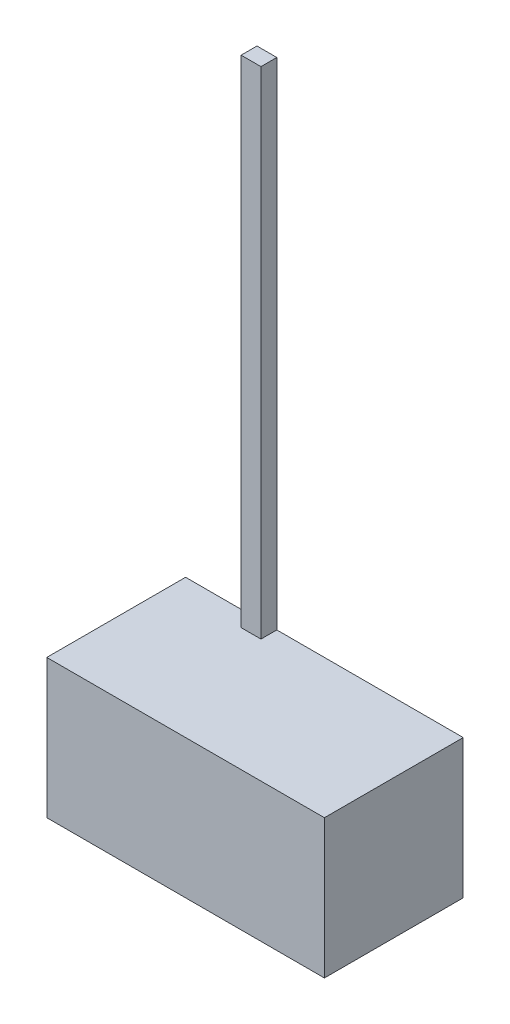
ISO-10303-21;
HEADER;
FILE_DESCRIPTION(('STEP AP214'),'2;1');
FILE_NAME('part.step','',(''),(''),'','','');
FILE_SCHEMA(('AUTOMOTIVE_DESIGN { 1 0 10303 214 1 1 1 1 }'));
ENDSEC;
DATA;
#1=APPLICATION_CONTEXT('core data for automotive mechanical design processes');
#2=APPLICATION_PROTOCOL_DEFINITION('international standard','automotive_design',2000,#1);
#3=PRODUCT_CONTEXT('',#1,'mechanical');
#4=PRODUCT('Part','Part','',(#3));
#5=PRODUCT_RELATED_PRODUCT_CATEGORY('part','',(#4));
#6=PRODUCT_DEFINITION_FORMATION('','',#4);
#7=PRODUCT_DEFINITION_CONTEXT('part definition',#1,'design');
#8=PRODUCT_DEFINITION('design','',#6,#7);
#9=PRODUCT_DEFINITION_SHAPE('','',#8);
#10=(LENGTH_UNIT() NAMED_UNIT(*) SI_UNIT(.MILLI.,.METRE.));
#11=(NAMED_UNIT(*) PLANE_ANGLE_UNIT() SI_UNIT($,.RADIAN.));
#12=(NAMED_UNIT(*) SI_UNIT($,.STERADIAN.) SOLID_ANGLE_UNIT());
#13=UNCERTAINTY_MEASURE_WITH_UNIT(LENGTH_MEASURE(1.E-05),#10,'distance_accuracy_value','');
#14=(GEOMETRIC_REPRESENTATION_CONTEXT(3) GLOBAL_UNCERTAINTY_ASSIGNED_CONTEXT((#13)) GLOBAL_UNIT_ASSIGNED_CONTEXT((#10,
#11,#12)) REPRESENTATION_CONTEXT('',''));
#15=CARTESIAN_POINT('',(0.,0.,0.));
#16=DIRECTION('',(0.,0.,1.));
#17=DIRECTION('',(1.,0.,0.));
#18=AXIS2_PLACEMENT_3D('',#15,#16,#17);
#19=CARTESIAN_POINT('',(2300.,-1450.,350.));
#20=DIRECTION('',(0.,-1.,0.));
#21=DIRECTION('',(0.,0.,-1.));
#22=AXIS2_PLACEMENT_3D('',#19,#20,#21);
#23=PLANE('',#22);
#24=DIRECTION('',(-1.,0.,0.));
#25=VECTOR('',#24,1.);
#26=CARTESIAN_POINT('',(2300.,-1450.,0.));
#27=LINE('',#26,#25);
#28=CARTESIAN_POINT('',(2300.,-1450.,0.));
#29=VERTEX_POINT('',#28);
#30=CARTESIAN_POINT('',(1600.,-1450.,0.));
#31=VERTEX_POINT('',#30);
#32=EDGE_CURVE('E115',#29,#31,#27,.T.);
#33=ORIENTED_EDGE('',*,*,#32,.T.);
#34=DIRECTION('',(0.,0.,-1.));
#35=VECTOR('',#34,1.);
#36=CARTESIAN_POINT('',(1600.,-1450.,350.));
#37=LINE('',#36,#35);
#38=CARTESIAN_POINT('',(1600.,-1450.,350.));
#39=VERTEX_POINT('',#38);
#40=EDGE_CURVE('E12',#39,#31,#37,.T.);
#41=ORIENTED_EDGE('',*,*,#40,.F.);
#42=DIRECTION('',(-1.,0.,0.));
#43=VECTOR('',#42,1.);
#44=CARTESIAN_POINT('',(2300.,-1450.,350.));
#45=LINE('',#44,#43);
#46=CARTESIAN_POINT('',(2300.,-1450.,350.));
#47=VERTEX_POINT('',#46);
#48=EDGE_CURVE('E99',#47,#39,#45,.T.);
#49=ORIENTED_EDGE('',*,*,#48,.F.);
#50=DIRECTION('',(0.,0.,-1.));
#51=VECTOR('',#50,1.);
#52=CARTESIAN_POINT('',(2300.,-1450.,350.));
#53=LINE('',#52,#51);
#54=EDGE_CURVE('E110',#47,#29,#53,.T.);
#55=ORIENTED_EDGE('',*,*,#54,.T.);
#56=EDGE_LOOP('',(#33,#41,#49,#55));
#57=FACE_BOUND('',#56,.T.);
#58=ADVANCED_FACE('F47',(#57),#23,.F.);
#59=CARTESIAN_POINT('',(1600.,-1450.,350.));
#60=DIRECTION('',(1.,0.,0.));
#61=DIRECTION('',(0.,0.,-1.));
#62=AXIS2_PLACEMENT_3D('',#59,#60,#61);
#63=PLANE('',#62);
#64=DIRECTION('',(0.,-1.,0.));
#65=VECTOR('',#64,1.);
#66=CARTESIAN_POINT('',(1600.,-1450.,0.));
#67=LINE('',#66,#65);
#68=CARTESIAN_POINT('',(1600.,-1800.,0.));
#69=VERTEX_POINT('',#68);
#70=EDGE_CURVE('E101',#31,#69,#67,.T.);
#71=ORIENTED_EDGE('',*,*,#70,.T.);
#72=DIRECTION('',(0.,0.,-1.));
#73=VECTOR('',#72,1.);
#74=CARTESIAN_POINT('',(1600.,-1800.,350.));
#75=LINE('',#74,#73);
#76=CARTESIAN_POINT('',(1600.,-1800.,350.));
#77=VERTEX_POINT('',#76);
#78=EDGE_CURVE('E60',#77,#69,#75,.T.);
#79=ORIENTED_EDGE('',*,*,#78,.F.);
#80=DIRECTION('',(0.,-1.,0.));
#81=VECTOR('',#80,1.);
#82=CARTESIAN_POINT('',(1600.,-1450.,350.));
#83=LINE('',#82,#81);
#84=EDGE_CURVE('E94',#39,#77,#83,.T.);
#85=ORIENTED_EDGE('',*,*,#84,.F.);
#86=ORIENTED_EDGE('',*,*,#40,.T.);
#87=EDGE_LOOP('',(#71,#79,#85,#86));
#88=FACE_BOUND('',#87,.T.);
#89=ADVANCED_FACE('F104',(#88),#63,.F.);
#90=CARTESIAN_POINT('',(1600.,-1800.,350.));
#91=DIRECTION('',(0.,1.,0.));
#92=DIRECTION('',(0.,0.,1.));
#93=AXIS2_PLACEMENT_3D('',#90,#91,#92);
#94=PLANE('',#93);
#95=DIRECTION('',(1.,0.,0.));
#96=VECTOR('',#95,1.);
#97=CARTESIAN_POINT('',(1600.,-1800.,0.));
#98=LINE('',#97,#96);
#99=CARTESIAN_POINT('',(2300.,-1800.,0.));
#100=VERTEX_POINT('',#99);
#101=EDGE_CURVE('E85',#69,#100,#98,.T.);
#102=ORIENTED_EDGE('',*,*,#101,.T.);
#103=DIRECTION('',(0.,0.,-1.));
#104=VECTOR('',#103,1.);
#105=CARTESIAN_POINT('',(2300.,-1800.,350.));
#106=LINE('',#105,#104);
#107=CARTESIAN_POINT('',(2300.,-1800.,350.));
#108=VERTEX_POINT('',#107);
#109=EDGE_CURVE('E103',#108,#100,#106,.T.);
#110=ORIENTED_EDGE('',*,*,#109,.F.);
#111=DIRECTION('',(1.,0.,0.));
#112=VECTOR('',#111,1.);
#113=CARTESIAN_POINT('',(1600.,-1800.,350.));
#114=LINE('',#113,#112);
#115=EDGE_CURVE('E97',#77,#108,#114,.T.);
#116=ORIENTED_EDGE('',*,*,#115,.F.);
#117=ORIENTED_EDGE('',*,*,#78,.T.);
#118=EDGE_LOOP('',(#102,#110,#116,#117));
#119=FACE_BOUND('',#118,.T.);
#120=ADVANCED_FACE('F107',(#119),#94,.F.);
#121=CARTESIAN_POINT('',(2300.,-1800.,350.));
#122=DIRECTION('',(-1.,0.,0.));
#123=DIRECTION('',(0.,0.,1.));
#124=AXIS2_PLACEMENT_3D('',#121,#122,#123);
#125=PLANE('',#124);
#126=DIRECTION('',(0.,1.,0.));
#127=VECTOR('',#126,1.);
#128=CARTESIAN_POINT('',(2300.,-1800.,0.));
#129=LINE('',#128,#127);
#130=EDGE_CURVE('E88',#100,#29,#129,.T.);
#131=ORIENTED_EDGE('',*,*,#130,.T.);
#132=ORIENTED_EDGE('',*,*,#54,.F.);
#133=DIRECTION('',(0.,1.,0.));
#134=VECTOR('',#133,1.);
#135=CARTESIAN_POINT('',(2300.,-1800.,350.));
#136=LINE('',#135,#134);
#137=EDGE_CURVE('E63',#108,#47,#136,.T.);
#138=ORIENTED_EDGE('',*,*,#137,.F.);
#139=ORIENTED_EDGE('',*,*,#109,.T.);
#140=EDGE_LOOP('',(#131,#132,#138,#139));
#141=FACE_BOUND('',#140,.T.);
#142=ADVANCED_FACE('F116',(#141),#125,.F.);
#143=CARTESIAN_POINT('',(0.,0.,350.));
#144=DIRECTION('',(0.,0.,1.));
#145=DIRECTION('',(1.,0.,0.));
#146=AXIS2_PLACEMENT_3D('',#143,#144,#145);
#147=PLANE('',#146);
#148=ORIENTED_EDGE('',*,*,#48,.T.);
#149=ORIENTED_EDGE('',*,*,#84,.T.);
#150=ORIENTED_EDGE('',*,*,#115,.T.);
#151=ORIENTED_EDGE('',*,*,#137,.T.);
#152=EDGE_LOOP('',(#148,#149,#150,#151));
#153=FACE_BOUND('',#152,.T.);
#154=ADVANCED_FACE('F96',(#153),#147,.T.);
#155=CARTESIAN_POINT('',(0.,0.,0.));
#156=DIRECTION('',(0.,0.,1.));
#157=DIRECTION('',(1.,0.,0.));
#158=AXIS2_PLACEMENT_3D('',#155,#156,#157);
#159=PLANE('',#158);
#160=ORIENTED_EDGE('',*,*,#32,.F.);
#161=ORIENTED_EDGE('',*,*,#130,.F.);
#162=ORIENTED_EDGE('',*,*,#101,.F.);
#163=ORIENTED_EDGE('',*,*,#70,.F.);
#164=EDGE_LOOP('',(#160,#161,#162,#163));
#165=FACE_BOUND('',#164,.T.);
#166=ADVANCED_FACE('F122',(#165),#159,.F.);
#167=CLOSED_SHELL('',(#58,#89,#120,#142,#154,#166));
#168=MANIFOLD_SOLID_BREP('B2',#167);
#169=CARTESIAN_POINT('',(1830.,-200.,40.));
#170=DIRECTION('',(0.,-1.,0.));
#171=DIRECTION('',(0.,0.,-1.));
#172=AXIS2_PLACEMENT_3D('',#169,#170,#171);
#173=PLANE('',#172);
#174=DIRECTION('',(-1.,0.,0.));
#175=VECTOR('',#174,1.);
#176=CARTESIAN_POINT('',(1830.,-200.,0.));
#177=LINE('',#176,#175);
#178=CARTESIAN_POINT('',(1830.,-200.,0.));
#179=VERTEX_POINT('',#178);
#180=CARTESIAN_POINT('',(1780.,-200.,0.));
#181=VERTEX_POINT('',#180);
#182=EDGE_CURVE('E237',#179,#181,#177,.T.);
#183=ORIENTED_EDGE('',*,*,#182,.T.);
#184=DIRECTION('',(0.,0.,-1.));
#185=VECTOR('',#184,1.);
#186=CARTESIAN_POINT('',(1780.,-200.,40.));
#187=LINE('',#186,#185);
#188=CARTESIAN_POINT('',(1780.,-200.,40.));
#189=VERTEX_POINT('',#188);
#190=EDGE_CURVE('E50',#189,#181,#187,.T.);
#191=ORIENTED_EDGE('',*,*,#190,.F.);
#192=DIRECTION('',(-1.,0.,0.));
#193=VECTOR('',#192,1.);
#194=CARTESIAN_POINT('',(1830.,-200.,40.));
#195=LINE('',#194,#193);
#196=CARTESIAN_POINT('',(1830.,-200.,40.));
#197=VERTEX_POINT('',#196);
#198=EDGE_CURVE('E222',#197,#189,#195,.T.);
#199=ORIENTED_EDGE('',*,*,#198,.F.);
#200=DIRECTION('',(0.,0.,-1.));
#201=VECTOR('',#200,1.);
#202=CARTESIAN_POINT('',(1830.,-200.,40.));
#203=LINE('',#202,#201);
#204=EDGE_CURVE('E235',#197,#179,#203,.T.);
#205=ORIENTED_EDGE('',*,*,#204,.T.);
#206=EDGE_LOOP('',(#183,#191,#199,#205));
#207=FACE_BOUND('',#206,.T.);
#208=ADVANCED_FACE('F171',(#207),#173,.F.);
#209=CARTESIAN_POINT('',(1780.,-200.,40.));
#210=DIRECTION('',(1.,0.,0.));
#211=DIRECTION('',(0.,0.,-1.));
#212=AXIS2_PLACEMENT_3D('',#209,#210,#211);
#213=PLANE('',#212);
#214=DIRECTION('',(0.,-1.,0.));
#215=VECTOR('',#214,1.);
#216=CARTESIAN_POINT('',(1780.,-200.,0.));
#217=LINE('',#216,#215);
#218=CARTESIAN_POINT('',(1780.,-1450.,0.));
#219=VERTEX_POINT('',#218);
#220=EDGE_CURVE('E228',#181,#219,#217,.T.);
#221=ORIENTED_EDGE('',*,*,#220,.T.);
#222=DIRECTION('',(0.,0.,-1.));
#223=VECTOR('',#222,1.);
#224=CARTESIAN_POINT('',(1780.,-1450.,40.));
#225=LINE('',#224,#223);
#226=CARTESIAN_POINT('',(1780.,-1450.,40.));
#227=VERTEX_POINT('',#226);
#228=EDGE_CURVE('E181',#227,#219,#225,.T.);
#229=ORIENTED_EDGE('',*,*,#228,.F.);
#230=DIRECTION('',(0.,-1.,0.));
#231=VECTOR('',#230,1.);
#232=CARTESIAN_POINT('',(1780.,-200.,40.));
#233=LINE('',#232,#231);
#234=EDGE_CURVE('E219',#189,#227,#233,.T.);
#235=ORIENTED_EDGE('',*,*,#234,.F.);
#236=ORIENTED_EDGE('',*,*,#190,.T.);
#237=EDGE_LOOP('',(#221,#229,#235,#236));
#238=FACE_BOUND('',#237,.T.);
#239=ADVANCED_FACE('F230',(#238),#213,.F.);
#240=CARTESIAN_POINT('',(1780.,-1450.,40.));
#241=DIRECTION('',(0.,1.,0.));
#242=DIRECTION('',(0.,0.,1.));
#243=AXIS2_PLACEMENT_3D('',#240,#241,#242);
#244=PLANE('',#243);
#245=DIRECTION('',(1.,0.,0.));
#246=VECTOR('',#245,1.);
#247=CARTESIAN_POINT('',(1780.,-1450.,0.));
#248=LINE('',#247,#246);
#249=CARTESIAN_POINT('',(1830.,-1450.,0.));
#250=VERTEX_POINT('',#249);
#251=EDGE_CURVE('E207',#219,#250,#248,.T.);
#252=ORIENTED_EDGE('',*,*,#251,.T.);
#253=DIRECTION('',(0.,0.,-1.));
#254=VECTOR('',#253,1.);
#255=CARTESIAN_POINT('',(1830.,-1450.,40.));
#256=LINE('',#255,#254);
#257=CARTESIAN_POINT('',(1830.,-1450.,40.));
#258=VERTEX_POINT('',#257);
#259=EDGE_CURVE('E227',#258,#250,#256,.T.);
#260=ORIENTED_EDGE('',*,*,#259,.F.);
#261=DIRECTION('',(1.,0.,0.));
#262=VECTOR('',#261,1.);
#263=CARTESIAN_POINT('',(1780.,-1450.,40.));
#264=LINE('',#263,#262);
#265=EDGE_CURVE('E225',#227,#258,#264,.T.);
#266=ORIENTED_EDGE('',*,*,#265,.F.);
#267=ORIENTED_EDGE('',*,*,#228,.T.);
#268=EDGE_LOOP('',(#252,#260,#266,#267));
#269=FACE_BOUND('',#268,.T.);
#270=ADVANCED_FACE('F229',(#269),#244,.F.);
#271=CARTESIAN_POINT('',(1830.,-1450.,40.));
#272=DIRECTION('',(-1.,0.,0.));
#273=DIRECTION('',(0.,0.,1.));
#274=AXIS2_PLACEMENT_3D('',#271,#272,#273);
#275=PLANE('',#274);
#276=DIRECTION('',(0.,1.,0.));
#277=VECTOR('',#276,1.);
#278=CARTESIAN_POINT('',(1830.,-1450.,0.));
#279=LINE('',#278,#277);
#280=EDGE_CURVE('E212',#250,#179,#279,.T.);
#281=ORIENTED_EDGE('',*,*,#280,.T.);
#282=ORIENTED_EDGE('',*,*,#204,.F.);
#283=DIRECTION('',(0.,1.,0.));
#284=VECTOR('',#283,1.);
#285=CARTESIAN_POINT('',(1830.,-1450.,40.));
#286=LINE('',#285,#284);
#287=EDGE_CURVE('E188',#258,#197,#286,.T.);
#288=ORIENTED_EDGE('',*,*,#287,.F.);
#289=ORIENTED_EDGE('',*,*,#259,.T.);
#290=EDGE_LOOP('',(#281,#282,#288,#289));
#291=FACE_BOUND('',#290,.T.);
#292=ADVANCED_FACE('F245',(#291),#275,.F.);
#293=CARTESIAN_POINT('',(0.,0.,40.));
#294=DIRECTION('',(0.,0.,1.));
#295=DIRECTION('',(1.,0.,0.));
#296=AXIS2_PLACEMENT_3D('',#293,#294,#295);
#297=PLANE('',#296);
#298=ORIENTED_EDGE('',*,*,#198,.T.);
#299=ORIENTED_EDGE('',*,*,#234,.T.);
#300=ORIENTED_EDGE('',*,*,#265,.T.);
#301=ORIENTED_EDGE('',*,*,#287,.T.);
#302=EDGE_LOOP('',(#298,#299,#300,#301));
#303=FACE_BOUND('',#302,.T.);
#304=ADVANCED_FACE('F217',(#303),#297,.T.);
#305=CARTESIAN_POINT('',(0.,0.,0.));
#306=DIRECTION('',(0.,0.,1.));
#307=DIRECTION('',(1.,0.,0.));
#308=AXIS2_PLACEMENT_3D('',#305,#306,#307);
#309=PLANE('',#308);
#310=ORIENTED_EDGE('',*,*,#182,.F.);
#311=ORIENTED_EDGE('',*,*,#280,.F.);
#312=ORIENTED_EDGE('',*,*,#251,.F.);
#313=ORIENTED_EDGE('',*,*,#220,.F.);
#314=EDGE_LOOP('',(#310,#311,#312,#313));
#315=FACE_BOUND('',#314,.T.);
#316=ADVANCED_FACE('F247',(#315),#309,.F.);
#317=CLOSED_SHELL('',(#208,#239,#270,#292,#304,#316));
#318=MANIFOLD_SOLID_BREP('B6',#317);
#319=ADVANCED_BREP_SHAPE_REPRESENTATION('',(#18,#168,#318),#14);
#320=SHAPE_DEFINITION_REPRESENTATION(#9,#319);
ENDSEC;
END-ISO-10303-21;
